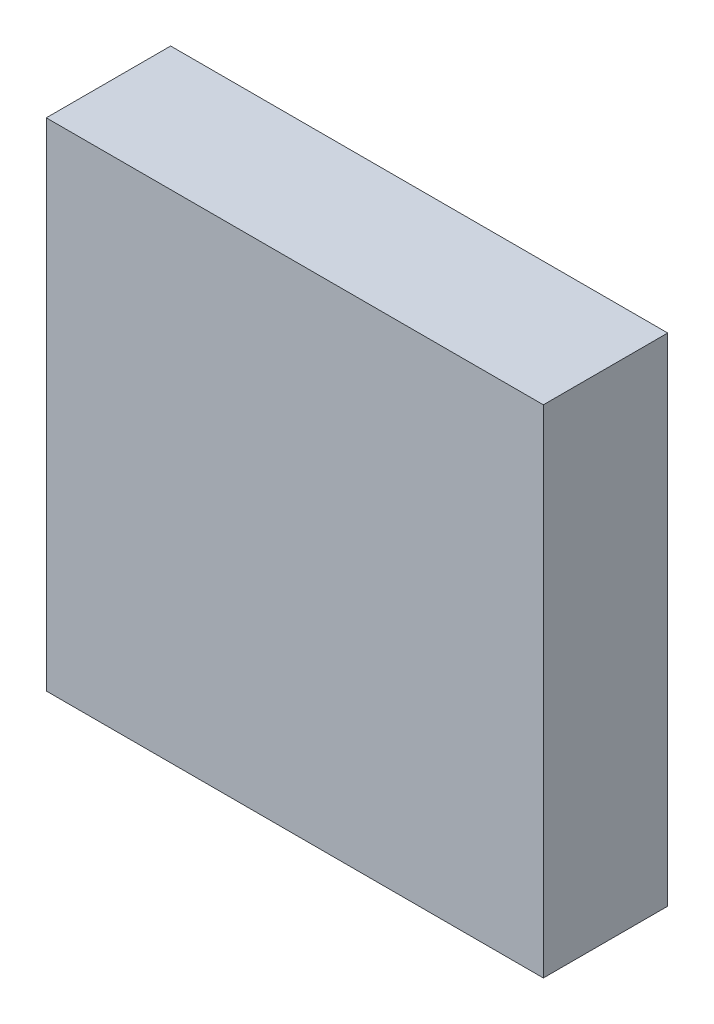
ISO-10303-21;
HEADER;
FILE_DESCRIPTION(('STEP AP214'),'2;1');
FILE_NAME('part.step','',(''),(''),'','','');
FILE_SCHEMA(('AUTOMOTIVE_DESIGN { 1 0 10303 214 1 1 1 1 }'));
ENDSEC;
DATA;
#1=APPLICATION_CONTEXT('core data for automotive mechanical design processes');
#2=APPLICATION_PROTOCOL_DEFINITION('international standard','automotive_design',2000,#1);
#3=PRODUCT_CONTEXT('',#1,'mechanical');
#4=PRODUCT('Part','Part','',(#3));
#5=PRODUCT_RELATED_PRODUCT_CATEGORY('part','',(#4));
#6=PRODUCT_DEFINITION_FORMATION('','',#4);
#7=PRODUCT_DEFINITION_CONTEXT('part definition',#1,'design');
#8=PRODUCT_DEFINITION('design','',#6,#7);
#9=PRODUCT_DEFINITION_SHAPE('','',#8);
#10=(LENGTH_UNIT() NAMED_UNIT(*) SI_UNIT(.MILLI.,.METRE.));
#11=(NAMED_UNIT(*) PLANE_ANGLE_UNIT() SI_UNIT($,.RADIAN.));
#12=(NAMED_UNIT(*) SI_UNIT($,.STERADIAN.) SOLID_ANGLE_UNIT());
#13=UNCERTAINTY_MEASURE_WITH_UNIT(LENGTH_MEASURE(1.E-05),#10,'distance_accuracy_value','');
#14=(GEOMETRIC_REPRESENTATION_CONTEXT(3) GLOBAL_UNCERTAINTY_ASSIGNED_CONTEXT((#13)) GLOBAL_UNIT_ASSIGNED_CONTEXT((#10,
#11,#12)) REPRESENTATION_CONTEXT('',''));
#15=CARTESIAN_POINT('',(0.,0.,0.));
#16=DIRECTION('',(0.,0.,1.));
#17=DIRECTION('',(1.,0.,0.));
#18=AXIS2_PLACEMENT_3D('',#15,#16,#17);
#19=CARTESIAN_POINT('',(-1.9984,2.0084,1.));
#20=DIRECTION('',(0.,0.,1.));
#21=DIRECTION('',(1.,0.,0.));
#22=AXIS2_PLACEMENT_3D('',#19,#20,#21);
#23=PLANE('',#22);
#24=DIRECTION('',(0.,1.,0.));
#25=VECTOR('',#24,1.);
#26=CARTESIAN_POINT('',(1.9984,2.0084,1.));
#27=LINE('',#26,#25);
#28=CARTESIAN_POINT('',(1.9984,2.0084,1.));
#29=VERTEX_POINT('',#28);
#30=CARTESIAN_POINT('',(1.9984,-1.983,1.));
#31=VERTEX_POINT('',#30);
#32=EDGE_CURVE('E53',#29,#31,#27,.F.);
#33=ORIENTED_EDGE('',*,*,#32,.F.);
#34=DIRECTION('',(1.,0.,0.));
#35=VECTOR('',#34,1.);
#36=CARTESIAN_POINT('',(-1.9984,2.0084,1.));
#37=LINE('',#36,#35);
#38=CARTESIAN_POINT('',(-1.9984,2.0084,1.));
#39=VERTEX_POINT('',#38);
#40=EDGE_CURVE('E68',#39,#29,#37,.T.);
#41=ORIENTED_EDGE('',*,*,#40,.F.);
#42=DIRECTION('',(0.,1.,0.));
#43=VECTOR('',#42,1.);
#44=CARTESIAN_POINT('',(-1.9984,-1.983,1.));
#45=LINE('',#44,#43);
#46=CARTESIAN_POINT('',(-1.9984,-1.983,1.));
#47=VERTEX_POINT('',#46);
#48=EDGE_CURVE('E20',#47,#39,#45,.T.);
#49=ORIENTED_EDGE('',*,*,#48,.F.);
#50=DIRECTION('',(1.,0.,0.));
#51=VECTOR('',#50,1.);
#52=CARTESIAN_POINT('',(1.9984,-1.983,1.));
#53=LINE('',#52,#51);
#54=EDGE_CURVE('E58',#31,#47,#53,.F.);
#55=ORIENTED_EDGE('',*,*,#54,.F.);
#56=EDGE_LOOP('',(#33,#41,#49,#55));
#57=FACE_BOUND('',#56,.T.);
#58=ADVANCED_FACE('F17',(#57),#23,.T.);
#59=CARTESIAN_POINT('',(-1.9984,-1.983,0.));
#60=DIRECTION('',(-1.,0.,0.));
#61=DIRECTION('',(0.,0.,1.));
#62=AXIS2_PLACEMENT_3D('',#59,#60,#61);
#63=PLANE('',#62);
#64=DIRECTION('',(0.,0.,1.));
#65=VECTOR('',#64,1.);
#66=CARTESIAN_POINT('',(-1.9984,2.0084,0.));
#67=LINE('',#66,#65);
#68=CARTESIAN_POINT('',(-1.9984,2.0084,0.));
#69=VERTEX_POINT('',#68);
#70=EDGE_CURVE('E79',#69,#39,#67,.T.);
#71=ORIENTED_EDGE('',*,*,#70,.F.);
#72=DIRECTION('',(0.,1.,0.));
#73=VECTOR('',#72,1.);
#74=CARTESIAN_POINT('',(-1.9984,2.0084,0.));
#75=LINE('',#74,#73);
#76=CARTESIAN_POINT('',(-1.9984,-1.983,0.));
#77=VERTEX_POINT('',#76);
#78=EDGE_CURVE('E74',#69,#77,#75,.F.);
#79=ORIENTED_EDGE('',*,*,#78,.T.);
#80=DIRECTION('',(0.,0.,-1.));
#81=VECTOR('',#80,1.);
#82=CARTESIAN_POINT('',(-1.9984,-1.983,0.));
#83=LINE('',#82,#81);
#84=EDGE_CURVE('E63',#47,#77,#83,.T.);
#85=ORIENTED_EDGE('',*,*,#84,.F.);
#86=ORIENTED_EDGE('',*,*,#48,.T.);
#87=EDGE_LOOP('',(#71,#79,#85,#86));
#88=FACE_BOUND('',#87,.T.);
#89=ADVANCED_FACE('F73',(#88),#63,.T.);
#90=CARTESIAN_POINT('',(1.9984,-1.983,0.));
#91=DIRECTION('',(0.,-1.,0.));
#92=DIRECTION('',(0.,0.,-1.));
#93=AXIS2_PLACEMENT_3D('',#90,#91,#92);
#94=PLANE('',#93);
#95=ORIENTED_EDGE('',*,*,#84,.T.);
#96=DIRECTION('',(1.,0.,0.));
#97=VECTOR('',#96,1.);
#98=CARTESIAN_POINT('',(-1.9984,-1.983,0.));
#99=LINE('',#98,#97);
#100=CARTESIAN_POINT('',(1.9984,-1.983,0.));
#101=VERTEX_POINT('',#100);
#102=EDGE_CURVE('E84',#77,#101,#99,.T.);
#103=ORIENTED_EDGE('',*,*,#102,.T.);
#104=DIRECTION('',(0.,0.,-1.));
#105=VECTOR('',#104,1.);
#106=CARTESIAN_POINT('',(1.9984,-1.983,0.));
#107=LINE('',#106,#105);
#108=EDGE_CURVE('E65',#31,#101,#107,.T.);
#109=ORIENTED_EDGE('',*,*,#108,.F.);
#110=ORIENTED_EDGE('',*,*,#54,.T.);
#111=EDGE_LOOP('',(#95,#103,#109,#110));
#112=FACE_BOUND('',#111,.T.);
#113=ADVANCED_FACE('F60',(#112),#94,.T.);
#114=CARTESIAN_POINT('',(1.9984,2.0084,0.));
#115=DIRECTION('',(1.,0.,0.));
#116=DIRECTION('',(0.,0.,-1.));
#117=AXIS2_PLACEMENT_3D('',#114,#115,#116);
#118=PLANE('',#117);
#119=ORIENTED_EDGE('',*,*,#108,.T.);
#120=DIRECTION('',(0.,1.,0.));
#121=VECTOR('',#120,1.);
#122=CARTESIAN_POINT('',(1.9984,2.0084,0.));
#123=LINE('',#122,#121);
#124=CARTESIAN_POINT('',(1.9984,2.0084,0.));
#125=VERTEX_POINT('',#124);
#126=EDGE_CURVE('E26',#101,#125,#123,.T.);
#127=ORIENTED_EDGE('',*,*,#126,.T.);
#128=DIRECTION('',(0.,0.,1.));
#129=VECTOR('',#128,1.);
#130=CARTESIAN_POINT('',(1.9984,2.0084,0.));
#131=LINE('',#130,#129);
#132=EDGE_CURVE('E34',#29,#125,#131,.F.);
#133=ORIENTED_EDGE('',*,*,#132,.F.);
#134=ORIENTED_EDGE('',*,*,#32,.T.);
#135=EDGE_LOOP('',(#119,#127,#133,#134));
#136=FACE_BOUND('',#135,.T.);
#137=ADVANCED_FACE('F88',(#136),#118,.T.);
#138=CARTESIAN_POINT('',(-1.9984,2.0084,0.));
#139=DIRECTION('',(0.,1.,0.));
#140=DIRECTION('',(0.,0.,1.));
#141=AXIS2_PLACEMENT_3D('',#138,#139,#140);
#142=PLANE('',#141);
#143=ORIENTED_EDGE('',*,*,#132,.T.);
#144=DIRECTION('',(1.,0.,0.));
#145=VECTOR('',#144,1.);
#146=CARTESIAN_POINT('',(-1.9984,2.0084,0.));
#147=LINE('',#146,#145);
#148=EDGE_CURVE('E11',#125,#69,#147,.F.);
#149=ORIENTED_EDGE('',*,*,#148,.T.);
#150=ORIENTED_EDGE('',*,*,#70,.T.);
#151=ORIENTED_EDGE('',*,*,#40,.T.);
#152=EDGE_LOOP('',(#143,#149,#150,#151));
#153=FACE_BOUND('',#152,.T.);
#154=ADVANCED_FACE('F91',(#153),#142,.T.);
#155=CARTESIAN_POINT('',(-1.9984,2.0084,0.));
#156=DIRECTION('',(0.,0.,1.));
#157=DIRECTION('',(1.,0.,0.));
#158=AXIS2_PLACEMENT_3D('',#155,#156,#157);
#159=PLANE('',#158);
#160=ORIENTED_EDGE('',*,*,#126,.F.);
#161=ORIENTED_EDGE('',*,*,#102,.F.);
#162=ORIENTED_EDGE('',*,*,#78,.F.);
#163=ORIENTED_EDGE('',*,*,#148,.F.);
#164=EDGE_LOOP('',(#160,#161,#162,#163));
#165=FACE_BOUND('',#164,.T.);
#166=ADVANCED_FACE('F90',(#165),#159,.F.);
#167=CLOSED_SHELL('',(#58,#89,#113,#137,#154,#166));
#168=MANIFOLD_SOLID_BREP('B1',#167);
#169=ADVANCED_BREP_SHAPE_REPRESENTATION('',(#18,#168),#14);
#170=SHAPE_DEFINITION_REPRESENTATION(#9,#169);
ENDSEC;
END-ISO-10303-21;
